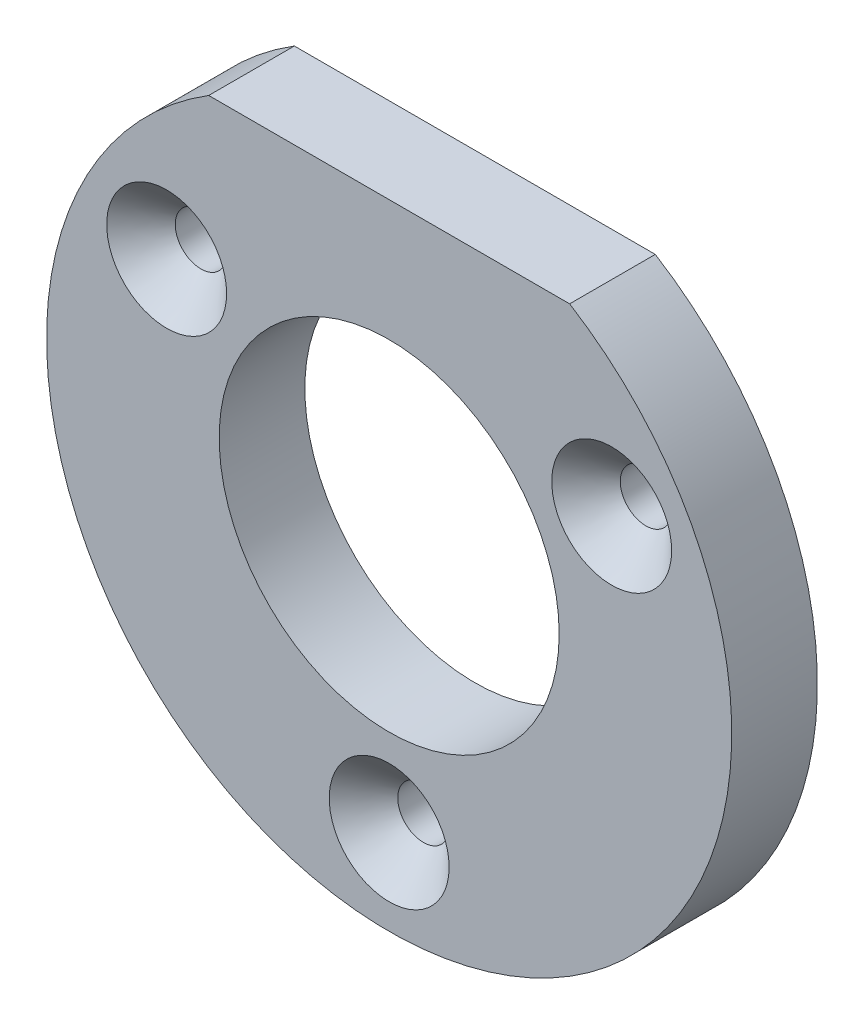
ISO-10303-21;
HEADER;
FILE_DESCRIPTION(('STEP AP214'),'2;1');
FILE_NAME('part.step','',(''),(''),'','','');
FILE_SCHEMA(('AUTOMOTIVE_DESIGN { 1 0 10303 214 1 1 1 1 }'));
ENDSEC;
DATA;
#1=APPLICATION_CONTEXT('core data for automotive mechanical design processes');
#2=APPLICATION_PROTOCOL_DEFINITION('international standard','automotive_design',2000,#1);
#3=PRODUCT_CONTEXT('',#1,'mechanical');
#4=PRODUCT('Part','Part','',(#3));
#5=PRODUCT_RELATED_PRODUCT_CATEGORY('part','',(#4));
#6=PRODUCT_DEFINITION_FORMATION('','',#4);
#7=PRODUCT_DEFINITION_CONTEXT('part definition',#1,'design');
#8=PRODUCT_DEFINITION('design','',#6,#7);
#9=PRODUCT_DEFINITION_SHAPE('','',#8);
#10=(LENGTH_UNIT() NAMED_UNIT(*) SI_UNIT(.MILLI.,.METRE.));
#11=(NAMED_UNIT(*) PLANE_ANGLE_UNIT() SI_UNIT($,.RADIAN.));
#12=(NAMED_UNIT(*) SI_UNIT($,.STERADIAN.) SOLID_ANGLE_UNIT());
#13=UNCERTAINTY_MEASURE_WITH_UNIT(LENGTH_MEASURE(1.E-05),#10,'distance_accuracy_value','');
#14=(GEOMETRIC_REPRESENTATION_CONTEXT(3) GLOBAL_UNCERTAINTY_ASSIGNED_CONTEXT((#13)) GLOBAL_UNIT_ASSIGNED_CONTEXT((#10,
#11,#12)) REPRESENTATION_CONTEXT('',''));
#15=CARTESIAN_POINT('',(0.,0.,0.));
#16=DIRECTION('',(0.,0.,1.));
#17=DIRECTION('',(1.,0.,0.));
#18=AXIS2_PLACEMENT_3D('',#15,#16,#17);
#19=CARTESIAN_POINT('',(0.,0.,5.));
#20=DIRECTION('',(0.,0.,1.));
#21=DIRECTION('',(1.,0.,0.));
#22=AXIS2_PLACEMENT_3D('',#19,#20,#21);
#23=PLANE('',#22);
#24=CARTESIAN_POINT('',(0.,-15.,5.));
#25=DIRECTION('',(0.,0.,1.));
#26=DIRECTION('',(1.,0.,0.));
#27=AXIS2_PLACEMENT_3D('',#24,#25,#26);
#28=CIRCLE('',#27,3.5);
#29=CARTESIAN_POINT('',(3.5,-15.,5.));
#30=VERTEX_POINT('',#29);
#31=EDGE_CURVE('E108',#30,#30,#28,.F.);
#32=ORIENTED_EDGE('',*,*,#31,.T.);
#33=EDGE_LOOP('',(#32));
#34=FACE_BOUND('',#33,.T.);
#35=CARTESIAN_POINT('',(12.9903810567665,7.50000000000006,5.));
#36=DIRECTION('',(0.,0.,1.));
#37=DIRECTION('',(1.,0.,0.));
#38=AXIS2_PLACEMENT_3D('',#35,#36,#37);
#39=CIRCLE('',#38,3.5);
#40=CARTESIAN_POINT('',(16.4903810567665,7.50000000000006,5.));
#41=VERTEX_POINT('',#40);
#42=EDGE_CURVE('E104',#41,#41,#39,.F.);
#43=ORIENTED_EDGE('',*,*,#42,.T.);
#44=EDGE_LOOP('',(#43));
#45=FACE_BOUND('',#44,.T.);
#46=CARTESIAN_POINT('',(-12.9903810567666,7.49999999999988,5.));
#47=DIRECTION('',(0.,0.,1.));
#48=DIRECTION('',(1.,0.,0.));
#49=AXIS2_PLACEMENT_3D('',#46,#47,#48);
#50=CIRCLE('',#49,3.5);
#51=CARTESIAN_POINT('',(-9.49038105676665,7.49999999999988,5.));
#52=VERTEX_POINT('',#51);
#53=EDGE_CURVE('E100',#52,#52,#50,.F.);
#54=ORIENTED_EDGE('',*,*,#53,.T.);
#55=EDGE_LOOP('',(#54));
#56=FACE_BOUND('',#55,.T.);
#57=CARTESIAN_POINT('',(0.,0.,5.));
#58=DIRECTION('',(0.,0.,1.));
#59=DIRECTION('',(1.,0.,0.));
#60=AXIS2_PLACEMENT_3D('',#57,#58,#59);
#61=CIRCLE('',#60,20.);
#62=CARTESIAN_POINT('',(-10.5356537528527,17.,5.));
#63=VERTEX_POINT('',#62);
#64=CARTESIAN_POINT('',(10.5356537528527,17.,5.));
#65=VERTEX_POINT('',#64);
#66=EDGE_CURVE('E75',#63,#65,#61,.T.);
#67=ORIENTED_EDGE('',*,*,#66,.T.);
#68=DIRECTION('',(-1.,0.,0.));
#69=VECTOR('',#68,1.);
#70=CARTESIAN_POINT('',(10.5356537528527,17.,5.));
#71=LINE('',#70,#69);
#72=EDGE_CURVE('E54',#65,#63,#71,.T.);
#73=ORIENTED_EDGE('',*,*,#72,.T.);
#74=EDGE_LOOP('',(#67,#73));
#75=FACE_BOUND('',#74,.T.);
#76=CARTESIAN_POINT('',(0.,0.,5.));
#77=DIRECTION('',(0.,0.,1.));
#78=DIRECTION('',(1.,0.,0.));
#79=AXIS2_PLACEMENT_3D('',#76,#77,#78);
#80=CIRCLE('',#79,9.925);
#81=CARTESIAN_POINT('',(9.925,0.,5.));
#82=VERTEX_POINT('',#81);
#83=EDGE_CURVE('E84',#82,#82,#80,.T.);
#84=ORIENTED_EDGE('',*,*,#83,.F.);
#85=EDGE_LOOP('',(#84));
#86=FACE_BOUND('',#85,.T.);
#87=ADVANCED_FACE('F38',(#34,#45,#56,#75,#86),#23,.T.);
#88=CARTESIAN_POINT('',(0.,0.,0.));
#89=DIRECTION('',(0.,0.,1.));
#90=DIRECTION('',(1.,0.,0.));
#91=AXIS2_PLACEMENT_3D('',#88,#89,#90);
#92=PLANE('',#91);
#93=CARTESIAN_POINT('',(-12.9903810567666,7.49999999999988,0.));
#94=DIRECTION('',(0.,0.,1.));
#95=DIRECTION('',(-0.499999999999992,-0.866025403784443,0.));
#96=AXIS2_PLACEMENT_3D('',#93,#94,#95);
#97=CIRCLE('',#96,1.5);
#98=CARTESIAN_POINT('',(-13.7403810567666,6.20096189432321,0.));
#99=VERTEX_POINT('',#98);
#100=EDGE_CURVE('E222',#99,#99,#97,.T.);
#101=ORIENTED_EDGE('',*,*,#100,.T.);
#102=EDGE_LOOP('',(#101));
#103=FACE_BOUND('',#102,.T.);
#104=CARTESIAN_POINT('',(12.9903810567665,7.50000000000006,0.));
#105=DIRECTION('',(0.,0.,1.));
#106=DIRECTION('',(-0.500000000000004,0.866025403784436,0.));
#107=AXIS2_PLACEMENT_3D('',#104,#105,#106);
#108=CIRCLE('',#107,1.5);
#109=CARTESIAN_POINT('',(12.2403810567665,8.79903810567672,0.));
#110=VERTEX_POINT('',#109);
#111=EDGE_CURVE('E223',#110,#110,#108,.T.);
#112=ORIENTED_EDGE('',*,*,#111,.T.);
#113=EDGE_LOOP('',(#112));
#114=FACE_BOUND('',#113,.T.);
#115=CARTESIAN_POINT('',(0.,-15.,0.));
#116=DIRECTION('',(0.,0.,1.));
#117=DIRECTION('',(1.,0.,0.));
#118=AXIS2_PLACEMENT_3D('',#115,#116,#117);
#119=CIRCLE('',#118,1.5);
#120=CARTESIAN_POINT('',(1.5,-15.,0.));
#121=VERTEX_POINT('',#120);
#122=EDGE_CURVE('E226',#121,#121,#119,.T.);
#123=ORIENTED_EDGE('',*,*,#122,.T.);
#124=EDGE_LOOP('',(#123));
#125=FACE_BOUND('',#124,.T.);
#126=CARTESIAN_POINT('',(0.,0.,0.));
#127=DIRECTION('',(0.,0.,1.));
#128=DIRECTION('',(1.,0.,0.));
#129=AXIS2_PLACEMENT_3D('',#126,#127,#128);
#130=CIRCLE('',#129,20.);
#131=CARTESIAN_POINT('',(-10.5356537528527,17.,0.));
#132=VERTEX_POINT('',#131);
#133=CARTESIAN_POINT('',(10.5356537528527,17.,0.));
#134=VERTEX_POINT('',#133);
#135=EDGE_CURVE('E76',#132,#134,#130,.T.);
#136=ORIENTED_EDGE('',*,*,#135,.F.);
#137=DIRECTION('',(-1.,0.,0.));
#138=VECTOR('',#137,1.);
#139=CARTESIAN_POINT('',(10.5356537528527,17.,0.));
#140=LINE('',#139,#138);
#141=EDGE_CURVE('E64',#134,#132,#140,.T.);
#142=ORIENTED_EDGE('',*,*,#141,.F.);
#143=EDGE_LOOP('',(#136,#142));
#144=FACE_BOUND('',#143,.T.);
#145=CARTESIAN_POINT('',(0.,0.,0.));
#146=DIRECTION('',(0.,0.,1.));
#147=DIRECTION('',(1.,0.,0.));
#148=AXIS2_PLACEMENT_3D('',#145,#146,#147);
#149=CIRCLE('',#148,9.925);
#150=CARTESIAN_POINT('',(9.925,0.,0.));
#151=VERTEX_POINT('',#150);
#152=EDGE_CURVE('E90',#151,#151,#149,.T.);
#153=ORIENTED_EDGE('',*,*,#152,.T.);
#154=EDGE_LOOP('',(#153));
#155=FACE_BOUND('',#154,.T.);
#156=ADVANCED_FACE('F81',(#103,#114,#125,#144,#155),#92,.F.);
#157=CARTESIAN_POINT('',(0.,0.,5.));
#158=DIRECTION('',(0.,0.,-1.));
#159=DIRECTION('',(-1.,0.,0.));
#160=AXIS2_PLACEMENT_3D('',#157,#158,#159);
#161=CYLINDRICAL_SURFACE('',#160,20.);
#162=ORIENTED_EDGE('',*,*,#135,.T.);
#163=DIRECTION('',(0.,0.,-1.));
#164=VECTOR('',#163,1.);
#165=CARTESIAN_POINT('',(10.5356537528527,17.,5.));
#166=LINE('',#165,#164);
#167=EDGE_CURVE('E72',#65,#134,#166,.T.);
#168=ORIENTED_EDGE('',*,*,#167,.F.);
#169=ORIENTED_EDGE('',*,*,#66,.F.);
#170=DIRECTION('',(0.,0.,-1.));
#171=VECTOR('',#170,1.);
#172=CARTESIAN_POINT('',(-10.5356537528527,17.,5.));
#173=LINE('',#172,#171);
#174=EDGE_CURVE('E69',#63,#132,#173,.T.);
#175=ORIENTED_EDGE('',*,*,#174,.T.);
#176=EDGE_LOOP('',(#162,#168,#169,#175));
#177=FACE_BOUND('',#176,.T.);
#178=ADVANCED_FACE('F79',(#177),#161,.T.);
#179=CARTESIAN_POINT('',(10.5356537528527,17.,5.));
#180=DIRECTION('',(0.,-1.,0.));
#181=DIRECTION('',(0.,0.,-1.));
#182=AXIS2_PLACEMENT_3D('',#179,#180,#181);
#183=PLANE('',#182);
#184=ORIENTED_EDGE('',*,*,#141,.T.);
#185=ORIENTED_EDGE('',*,*,#174,.F.);
#186=ORIENTED_EDGE('',*,*,#72,.F.);
#187=ORIENTED_EDGE('',*,*,#167,.T.);
#188=EDGE_LOOP('',(#184,#185,#186,#187));
#189=FACE_BOUND('',#188,.T.);
#190=ADVANCED_FACE('F68',(#189),#183,.F.);
#191=CARTESIAN_POINT('',(0.,0.,5.));
#192=DIRECTION('',(0.,0.,-1.));
#193=DIRECTION('',(-1.,0.,0.));
#194=AXIS2_PLACEMENT_3D('',#191,#192,#193);
#195=CYLINDRICAL_SURFACE('',#194,9.925);
#196=ORIENTED_EDGE('',*,*,#83,.T.);
#197=EDGE_LOOP('',(#196));
#198=FACE_BOUND('',#197,.T.);
#199=ORIENTED_EDGE('',*,*,#152,.F.);
#200=EDGE_LOOP('',(#199));
#201=FACE_BOUND('',#200,.T.);
#202=ADVANCED_FACE('F140',(#198,#201),#195,.F.);
#203=CARTESIAN_POINT('',(0.,-15.,0.));
#204=DIRECTION('',(0.,0.,1.));
#205=DIRECTION('',(1.,0.,0.));
#206=AXIS2_PLACEMENT_3D('',#203,#204,#205);
#207=CYLINDRICAL_SURFACE('',#206,1.5);
#208=CARTESIAN_POINT('',(0.,-15.,3.));
#209=DIRECTION('',(0.,0.,1.));
#210=DIRECTION('',(1.,0.,0.));
#211=AXIS2_PLACEMENT_3D('',#208,#209,#210);
#212=CIRCLE('',#211,1.5);
#213=CARTESIAN_POINT('',(1.5,-15.,3.));
#214=VERTEX_POINT('',#213);
#215=EDGE_CURVE('E97',#214,#214,#212,.T.);
#216=ORIENTED_EDGE('',*,*,#215,.T.);
#217=EDGE_LOOP('',(#216));
#218=FACE_BOUND('',#217,.T.);
#219=ORIENTED_EDGE('',*,*,#122,.F.);
#220=EDGE_LOOP('',(#219));
#221=FACE_BOUND('',#220,.T.);
#222=ADVANCED_FACE('F160',(#218,#221),#207,.F.);
#223=CARTESIAN_POINT('',(12.9903810567665,7.50000000000006,0.));
#224=DIRECTION('',(0.,0.,1.));
#225=DIRECTION('',(1.,0.,0.));
#226=AXIS2_PLACEMENT_3D('',#223,#224,#225);
#227=CYLINDRICAL_SURFACE('',#226,1.5);
#228=CARTESIAN_POINT('',(12.9903810567665,7.50000000000006,3.));
#229=DIRECTION('',(0.,0.,1.));
#230=DIRECTION('',(1.,0.,0.));
#231=AXIS2_PLACEMENT_3D('',#228,#229,#230);
#232=CIRCLE('',#231,1.5);
#233=CARTESIAN_POINT('',(14.4903810567665,7.50000000000006,3.));
#234=VERTEX_POINT('',#233);
#235=EDGE_CURVE('E47',#234,#234,#232,.T.);
#236=ORIENTED_EDGE('',*,*,#235,.T.);
#237=EDGE_LOOP('',(#236));
#238=FACE_BOUND('',#237,.T.);
#239=ORIENTED_EDGE('',*,*,#111,.F.);
#240=EDGE_LOOP('',(#239));
#241=FACE_BOUND('',#240,.T.);
#242=ADVANCED_FACE('F114',(#238,#241),#227,.F.);
#243=CARTESIAN_POINT('',(-12.9903810567666,7.49999999999988,0.));
#244=DIRECTION('',(0.,0.,1.));
#245=DIRECTION('',(1.,0.,0.));
#246=AXIS2_PLACEMENT_3D('',#243,#244,#245);
#247=CYLINDRICAL_SURFACE('',#246,1.5);
#248=CARTESIAN_POINT('',(-12.9903810567666,7.49999999999988,3.00000000000001));
#249=DIRECTION('',(0.,0.,1.));
#250=DIRECTION('',(1.,0.,0.));
#251=AXIS2_PLACEMENT_3D('',#248,#249,#250);
#252=CIRCLE('',#251,1.5);
#253=CARTESIAN_POINT('',(-11.4903810567666,7.49999999999988,3.00000000000001));
#254=VERTEX_POINT('',#253);
#255=EDGE_CURVE('E11',#254,#254,#252,.T.);
#256=ORIENTED_EDGE('',*,*,#255,.T.);
#257=EDGE_LOOP('',(#256));
#258=FACE_BOUND('',#257,.T.);
#259=ORIENTED_EDGE('',*,*,#100,.F.);
#260=EDGE_LOOP('',(#259));
#261=FACE_BOUND('',#260,.T.);
#262=ADVANCED_FACE('F126',(#258,#261),#247,.F.);
#263=CARTESIAN_POINT('',(0.,-15.,3.));
#264=DIRECTION('',(0.,0.,1.));
#265=DIRECTION('',(1.,0.,0.));
#266=AXIS2_PLACEMENT_3D('',#263,#264,#265);
#267=CONICAL_SURFACE('',#266,1.5,0.785398163397449);
#268=ORIENTED_EDGE('',*,*,#31,.F.);
#269=EDGE_LOOP('',(#268));
#270=FACE_BOUND('',#269,.T.);
#271=ORIENTED_EDGE('',*,*,#215,.F.);
#272=EDGE_LOOP('',(#271));
#273=FACE_BOUND('',#272,.T.);
#274=ADVANCED_FACE('F119',(#270,#273),#267,.F.);
#275=CARTESIAN_POINT('',(12.9903810567665,7.50000000000006,3.));
#276=DIRECTION('',(0.,0.,1.));
#277=DIRECTION('',(1.,0.,0.));
#278=AXIS2_PLACEMENT_3D('',#275,#276,#277);
#279=CONICAL_SURFACE('',#278,1.5,0.785398163397449);
#280=ORIENTED_EDGE('',*,*,#42,.F.);
#281=EDGE_LOOP('',(#280));
#282=FACE_BOUND('',#281,.T.);
#283=ORIENTED_EDGE('',*,*,#235,.F.);
#284=EDGE_LOOP('',(#283));
#285=FACE_BOUND('',#284,.T.);
#286=ADVANCED_FACE('F117',(#282,#285),#279,.F.);
#287=CARTESIAN_POINT('',(-12.9903810567666,7.49999999999988,3.00000000000001));
#288=DIRECTION('',(0.,0.,1.));
#289=DIRECTION('',(1.,0.,0.));
#290=AXIS2_PLACEMENT_3D('',#287,#288,#289);
#291=CONICAL_SURFACE('',#290,1.5,0.785398163397449);
#292=ORIENTED_EDGE('',*,*,#53,.F.);
#293=EDGE_LOOP('',(#292));
#294=FACE_BOUND('',#293,.T.);
#295=ORIENTED_EDGE('',*,*,#255,.F.);
#296=EDGE_LOOP('',(#295));
#297=FACE_BOUND('',#296,.T.);
#298=ADVANCED_FACE('F40',(#294,#297),#291,.F.);
#299=CLOSED_SHELL('',(#87,#156,#178,#190,#202,#222,#242,#262,#274,#286,#298));
#300=MANIFOLD_SOLID_BREP('B2',#299);
#301=ADVANCED_BREP_SHAPE_REPRESENTATION('',(#18,#300),#14);
#302=SHAPE_DEFINITION_REPRESENTATION(#9,#301);
ENDSEC;
END-ISO-10303-21;
